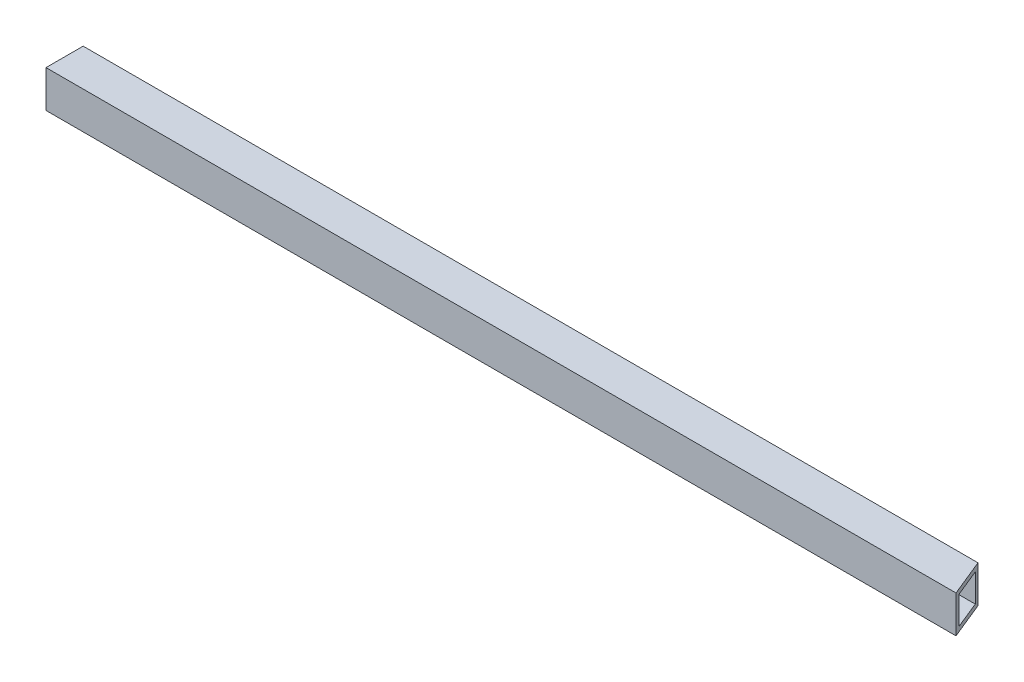
ISO-10303-21;
HEADER;
FILE_DESCRIPTION(('STEP AP214'),'2;1');
FILE_NAME('part.step','',(''),(''),'','','');
FILE_SCHEMA(('AUTOMOTIVE_DESIGN { 1 0 10303 214 1 1 1 1 }'));
ENDSEC;
DATA;
#1=APPLICATION_CONTEXT('core data for automotive mechanical design processes');
#2=APPLICATION_PROTOCOL_DEFINITION('international standard','automotive_design',2000,#1);
#3=PRODUCT_CONTEXT('',#1,'mechanical');
#4=PRODUCT('Part','Part','',(#3));
#5=PRODUCT_RELATED_PRODUCT_CATEGORY('part','',(#4));
#6=PRODUCT_DEFINITION_FORMATION('','',#4);
#7=PRODUCT_DEFINITION_CONTEXT('part definition',#1,'design');
#8=PRODUCT_DEFINITION('design','',#6,#7);
#9=PRODUCT_DEFINITION_SHAPE('','',#8);
#10=(LENGTH_UNIT() NAMED_UNIT(*) SI_UNIT(.MILLI.,.METRE.));
#11=(NAMED_UNIT(*) PLANE_ANGLE_UNIT() SI_UNIT($,.RADIAN.));
#12=(NAMED_UNIT(*) SI_UNIT($,.STERADIAN.) SOLID_ANGLE_UNIT());
#13=UNCERTAINTY_MEASURE_WITH_UNIT(LENGTH_MEASURE(1.E-05),#10,'distance_accuracy_value','');
#14=(GEOMETRIC_REPRESENTATION_CONTEXT(3) GLOBAL_UNCERTAINTY_ASSIGNED_CONTEXT((#13)) GLOBAL_UNIT_ASSIGNED_CONTEXT((#10,
#11,#12)) REPRESENTATION_CONTEXT('',''));
#15=CARTESIAN_POINT('',(0.,0.,0.));
#16=DIRECTION('',(0.,0.,1.));
#17=DIRECTION('',(1.,0.,0.));
#18=AXIS2_PLACEMENT_3D('',#15,#16,#17);
#19=CARTESIAN_POINT('',(0.,0.,0.));
#20=DIRECTION('',(1.,0.,0.));
#21=DIRECTION('',(0.,0.,-1.));
#22=AXIS2_PLACEMENT_3D('',#19,#20,#21);
#23=PLANE('',#22);
#24=DIRECTION('',(0.,1.,0.));
#25=VECTOR('',#24,1.);
#26=CARTESIAN_POINT('',(0.,12.7,-12.7));
#27=LINE('',#26,#25);
#28=CARTESIAN_POINT('',(0.,-12.7,-12.7));
#29=VERTEX_POINT('',#28);
#30=CARTESIAN_POINT('',(0.,12.7,-12.7));
#31=VERTEX_POINT('',#30);
#32=EDGE_CURVE('E117',#29,#31,#27,.T.);
#33=ORIENTED_EDGE('',*,*,#32,.F.);
#34=DIRECTION('',(0.,0.,-1.));
#35=VECTOR('',#34,1.);
#36=CARTESIAN_POINT('',(0.,-12.7,12.7));
#37=LINE('',#36,#35);
#38=CARTESIAN_POINT('',(0.,-12.7,12.7));
#39=VERTEX_POINT('',#38);
#40=EDGE_CURVE('E126',#39,#29,#37,.T.);
#41=ORIENTED_EDGE('',*,*,#40,.F.);
#42=DIRECTION('',(0.,-1.,0.));
#43=VECTOR('',#42,1.);
#44=CARTESIAN_POINT('',(0.,12.7,12.7));
#45=LINE('',#44,#43);
#46=CARTESIAN_POINT('',(0.,12.7,12.7));
#47=VERTEX_POINT('',#46);
#48=EDGE_CURVE('E129',#47,#39,#45,.T.);
#49=ORIENTED_EDGE('',*,*,#48,.F.);
#50=DIRECTION('',(0.,0.,1.));
#51=VECTOR('',#50,1.);
#52=CARTESIAN_POINT('',(0.,12.7,12.7));
#53=LINE('',#52,#51);
#54=EDGE_CURVE('E131',#31,#47,#53,.T.);
#55=ORIENTED_EDGE('',*,*,#54,.F.);
#56=EDGE_LOOP('',(#33,#41,#49,#55));
#57=FACE_BOUND('',#56,.T.);
#58=DIRECTION('',(0.,1.,0.));
#59=VECTOR('',#58,1.);
#60=CARTESIAN_POINT('',(0.,-9.525,-9.525));
#61=LINE('',#60,#59);
#62=CARTESIAN_POINT('',(0.,-9.525,-9.525));
#63=VERTEX_POINT('',#62);
#64=CARTESIAN_POINT('',(0.,9.525,-9.525));
#65=VERTEX_POINT('',#64);
#66=EDGE_CURVE('E151',#63,#65,#61,.T.);
#67=ORIENTED_EDGE('',*,*,#66,.T.);
#68=DIRECTION('',(0.,0.,1.));
#69=VECTOR('',#68,1.);
#70=CARTESIAN_POINT('',(0.,9.525,9.525));
#71=LINE('',#70,#69);
#72=CARTESIAN_POINT('',(0.,9.525,9.525));
#73=VERTEX_POINT('',#72);
#74=EDGE_CURVE('E148',#65,#73,#71,.T.);
#75=ORIENTED_EDGE('',*,*,#74,.T.);
#76=DIRECTION('',(0.,-1.,0.));
#77=VECTOR('',#76,1.);
#78=CARTESIAN_POINT('',(0.,-9.525,9.525));
#79=LINE('',#78,#77);
#80=CARTESIAN_POINT('',(0.,-9.525,9.525));
#81=VERTEX_POINT('',#80);
#82=EDGE_CURVE('E145',#73,#81,#79,.T.);
#83=ORIENTED_EDGE('',*,*,#82,.T.);
#84=DIRECTION('',(0.,0.,-1.));
#85=VECTOR('',#84,1.);
#86=CARTESIAN_POINT('',(0.,-9.525,9.525));
#87=LINE('',#86,#85);
#88=EDGE_CURVE('E142',#81,#63,#87,.T.);
#89=ORIENTED_EDGE('',*,*,#88,.T.);
#90=EDGE_LOOP('',(#67,#75,#83,#89));
#91=FACE_BOUND('',#90,.T.);
#92=ADVANCED_FACE('F33',(#57,#91),#23,.F.);
#93=CARTESIAN_POINT('',(622.3,12.7,-12.7));
#94=DIRECTION('',(0.,0.,1.));
#95=DIRECTION('',(0.,-1.,0.));
#96=AXIS2_PLACEMENT_3D('',#93,#94,#95);
#97=PLANE('',#96);
#98=DIRECTION('',(-1.,0.,0.));
#99=VECTOR('',#98,1.);
#100=CARTESIAN_POINT('',(622.3,12.7,-12.7));
#101=LINE('',#100,#99);
#102=CARTESIAN_POINT('',(611.938792348379,12.7,-12.7));
#103=VERTEX_POINT('',#102);
#104=EDGE_CURVE('E41',#103,#31,#101,.T.);
#105=ORIENTED_EDGE('',*,*,#104,.F.);
#106=DIRECTION('',(0.,1.,0.));
#107=VECTOR('',#106,1.);
#108=CARTESIAN_POINT('',(611.938792348379,-40.132,-12.7));
#109=LINE('',#108,#107);
#110=CARTESIAN_POINT('',(611.938792348379,-12.7,-12.7));
#111=VERTEX_POINT('',#110);
#112=EDGE_CURVE('E97',#111,#103,#109,.T.);
#113=ORIENTED_EDGE('',*,*,#112,.F.);
#114=DIRECTION('',(-1.,0.,0.));
#115=VECTOR('',#114,1.);
#116=CARTESIAN_POINT('',(622.3,-12.7,-12.7));
#117=LINE('',#116,#115);
#118=EDGE_CURVE('E123',#111,#29,#117,.T.);
#119=ORIENTED_EDGE('',*,*,#118,.T.);
#120=ORIENTED_EDGE('',*,*,#32,.T.);
#121=EDGE_LOOP('',(#105,#113,#119,#120));
#122=FACE_BOUND('',#121,.T.);
#123=ADVANCED_FACE('F35',(#122),#97,.F.);
#124=CARTESIAN_POINT('',(622.3,12.7,12.7));
#125=DIRECTION('',(0.,-1.,0.));
#126=DIRECTION('',(0.,0.,-1.));
#127=AXIS2_PLACEMENT_3D('',#124,#125,#126);
#128=PLANE('',#127);
#129=DIRECTION('',(-1.,0.,0.));
#130=VECTOR('',#129,1.);
#131=CARTESIAN_POINT('',(622.3,12.7,12.7));
#132=LINE('',#131,#130);
#133=CARTESIAN_POINT('',(622.3,12.7,12.7));
#134=VERTEX_POINT('',#133);
#135=EDGE_CURVE('E112',#134,#47,#132,.T.);
#136=ORIENTED_EDGE('',*,*,#135,.F.);
#137=DIRECTION('',(0.377705149155021,0.,0.925925925925926));
#138=VECTOR('',#137,1.);
#139=CARTESIAN_POINT('',(622.3,12.7,12.7));
#140=LINE('',#139,#138);
#141=EDGE_CURVE('E100',#103,#134,#140,.T.);
#142=ORIENTED_EDGE('',*,*,#141,.F.);
#143=ORIENTED_EDGE('',*,*,#104,.T.);
#144=ORIENTED_EDGE('',*,*,#54,.T.);
#145=EDGE_LOOP('',(#136,#142,#143,#144));
#146=FACE_BOUND('',#145,.T.);
#147=ADVANCED_FACE('F109',(#146),#128,.F.);
#148=CARTESIAN_POINT('',(622.3,12.7,12.7));
#149=DIRECTION('',(0.,0.,-1.));
#150=DIRECTION('',(0.,1.,0.));
#151=AXIS2_PLACEMENT_3D('',#148,#149,#150);
#152=PLANE('',#151);
#153=ORIENTED_EDGE('',*,*,#48,.T.);
#154=DIRECTION('',(-1.,0.,0.));
#155=VECTOR('',#154,1.);
#156=CARTESIAN_POINT('',(622.3,-12.7,12.7));
#157=LINE('',#156,#155);
#158=CARTESIAN_POINT('',(622.3,-12.7,12.7));
#159=VERTEX_POINT('',#158);
#160=EDGE_CURVE('E118',#159,#39,#157,.T.);
#161=ORIENTED_EDGE('',*,*,#160,.F.);
#162=DIRECTION('',(0.,-1.,0.));
#163=VECTOR('',#162,1.);
#164=CARTESIAN_POINT('',(622.3,12.7,12.7));
#165=LINE('',#164,#163);
#166=EDGE_CURVE('E125',#134,#159,#165,.T.);
#167=ORIENTED_EDGE('',*,*,#166,.F.);
#168=ORIENTED_EDGE('',*,*,#135,.T.);
#169=EDGE_LOOP('',(#153,#161,#167,#168));
#170=FACE_BOUND('',#169,.T.);
#171=ADVANCED_FACE('F181',(#170),#152,.F.);
#172=CARTESIAN_POINT('',(622.3,-12.7,12.7));
#173=DIRECTION('',(0.,1.,0.));
#174=DIRECTION('',(0.,0.,1.));
#175=AXIS2_PLACEMENT_3D('',#172,#173,#174);
#176=PLANE('',#175);
#177=ORIENTED_EDGE('',*,*,#118,.F.);
#178=DIRECTION('',(-0.377705149155021,0.,-0.925925925925926));
#179=VECTOR('',#178,1.);
#180=CARTESIAN_POINT('',(622.3,-12.7,12.7));
#181=LINE('',#180,#179);
#182=EDGE_CURVE('E103',#159,#111,#181,.T.);
#183=ORIENTED_EDGE('',*,*,#182,.F.);
#184=ORIENTED_EDGE('',*,*,#160,.T.);
#185=ORIENTED_EDGE('',*,*,#40,.T.);
#186=EDGE_LOOP('',(#177,#183,#184,#185));
#187=FACE_BOUND('',#186,.T.);
#188=ADVANCED_FACE('F174',(#187),#176,.F.);
#189=CARTESIAN_POINT('',(622.3,-9.525,-9.525));
#190=DIRECTION('',(0.,0.,1.));
#191=DIRECTION('',(1.,0.,0.));
#192=AXIS2_PLACEMENT_3D('',#189,#190,#191);
#193=PLANE('',#192);
#194=DIRECTION('',(0.,-1.,0.));
#195=VECTOR('',#194,1.);
#196=CARTESIAN_POINT('',(613.233943304832,-9.525,-9.525));
#197=LINE('',#196,#195);
#198=CARTESIAN_POINT('',(613.233943304832,9.525,-9.525));
#199=VERTEX_POINT('',#198);
#200=CARTESIAN_POINT('',(613.233943304832,-9.525,-9.525));
#201=VERTEX_POINT('',#200);
#202=EDGE_CURVE('E47',#199,#201,#197,.T.);
#203=ORIENTED_EDGE('',*,*,#202,.F.);
#204=DIRECTION('',(-1.,0.,0.));
#205=VECTOR('',#204,1.);
#206=CARTESIAN_POINT('',(622.3,9.525,-9.525));
#207=LINE('',#206,#205);
#208=EDGE_CURVE('E134',#199,#65,#207,.T.);
#209=ORIENTED_EDGE('',*,*,#208,.T.);
#210=ORIENTED_EDGE('',*,*,#66,.F.);
#211=DIRECTION('',(-1.,0.,0.));
#212=VECTOR('',#211,1.);
#213=CARTESIAN_POINT('',(622.3,-9.525,-9.525));
#214=LINE('',#213,#212);
#215=EDGE_CURVE('E54',#201,#63,#214,.T.);
#216=ORIENTED_EDGE('',*,*,#215,.F.);
#217=EDGE_LOOP('',(#203,#209,#210,#216));
#218=FACE_BOUND('',#217,.T.);
#219=ADVANCED_FACE('F172',(#218),#193,.T.);
#220=CARTESIAN_POINT('',(622.3,9.525,9.525));
#221=DIRECTION('',(0.,-1.,0.));
#222=DIRECTION('',(0.,0.,-1.));
#223=AXIS2_PLACEMENT_3D('',#220,#221,#222);
#224=PLANE('',#223);
#225=DIRECTION('',(-0.377705149155021,0.,-0.925925925925926));
#226=VECTOR('',#225,1.);
#227=CARTESIAN_POINT('',(621.189616806882,9.525,9.97794924554184));
#228=LINE('',#227,#226);
#229=CARTESIAN_POINT('',(621.004849043547,9.525,9.525));
#230=VERTEX_POINT('',#229);
#231=EDGE_CURVE('E155',#230,#199,#228,.T.);
#232=ORIENTED_EDGE('',*,*,#231,.F.);
#233=DIRECTION('',(-1.,0.,0.));
#234=VECTOR('',#233,1.);
#235=CARTESIAN_POINT('',(622.3,9.525,9.525));
#236=LINE('',#235,#234);
#237=EDGE_CURVE('E137',#230,#73,#236,.T.);
#238=ORIENTED_EDGE('',*,*,#237,.T.);
#239=ORIENTED_EDGE('',*,*,#74,.F.);
#240=ORIENTED_EDGE('',*,*,#208,.F.);
#241=EDGE_LOOP('',(#232,#238,#239,#240));
#242=FACE_BOUND('',#241,.T.);
#243=ADVANCED_FACE('F166',(#242),#224,.T.);
#244=CARTESIAN_POINT('',(622.3,-9.525,9.525));
#245=DIRECTION('',(0.,0.,-1.));
#246=DIRECTION('',(-1.,0.,0.));
#247=AXIS2_PLACEMENT_3D('',#244,#245,#246);
#248=PLANE('',#247);
#249=DIRECTION('',(0.,1.,0.));
#250=VECTOR('',#249,1.);
#251=CARTESIAN_POINT('',(621.004849043547,-9.525,9.525));
#252=LINE('',#251,#250);
#253=CARTESIAN_POINT('',(621.004849043547,-9.525,9.525));
#254=VERTEX_POINT('',#253);
#255=EDGE_CURVE('E157',#254,#230,#252,.T.);
#256=ORIENTED_EDGE('',*,*,#255,.F.);
#257=DIRECTION('',(-1.,0.,0.));
#258=VECTOR('',#257,1.);
#259=CARTESIAN_POINT('',(622.3,-9.525,9.525));
#260=LINE('',#259,#258);
#261=EDGE_CURVE('E139',#254,#81,#260,.T.);
#262=ORIENTED_EDGE('',*,*,#261,.T.);
#263=ORIENTED_EDGE('',*,*,#82,.F.);
#264=ORIENTED_EDGE('',*,*,#237,.F.);
#265=EDGE_LOOP('',(#256,#262,#263,#264));
#266=FACE_BOUND('',#265,.T.);
#267=ADVANCED_FACE('F169',(#266),#248,.T.);
#268=CARTESIAN_POINT('',(622.3,-9.525,9.525));
#269=DIRECTION('',(0.,1.,0.));
#270=DIRECTION('',(0.,0.,1.));
#271=AXIS2_PLACEMENT_3D('',#268,#269,#270);
#272=PLANE('',#271);
#273=DIRECTION('',(0.377705149155021,0.,0.925925925925926));
#274=VECTOR('',#273,1.);
#275=CARTESIAN_POINT('',(621.189616806882,-9.525,9.97794924554184));
#276=LINE('',#275,#274);
#277=EDGE_CURVE('E11',#201,#254,#276,.T.);
#278=ORIENTED_EDGE('',*,*,#277,.F.);
#279=ORIENTED_EDGE('',*,*,#215,.T.);
#280=ORIENTED_EDGE('',*,*,#88,.F.);
#281=ORIENTED_EDGE('',*,*,#261,.F.);
#282=EDGE_LOOP('',(#278,#279,#280,#281));
#283=FACE_BOUND('',#282,.T.);
#284=ADVANCED_FACE('F225',(#283),#272,.T.);
#285=CARTESIAN_POINT('',(622.3,-40.132,12.7));
#286=DIRECTION('',(-0.925925925925926,0.,0.37770514915502));
#287=DIRECTION('',(0.377705149155021,0.,0.925925925925926));
#288=AXIS2_PLACEMENT_3D('',#285,#286,#287);
#289=PLANE('',#288);
#290=ORIENTED_EDGE('',*,*,#202,.T.);
#291=ORIENTED_EDGE('',*,*,#277,.T.);
#292=ORIENTED_EDGE('',*,*,#255,.T.);
#293=ORIENTED_EDGE('',*,*,#231,.T.);
#294=EDGE_LOOP('',(#290,#291,#292,#293));
#295=FACE_BOUND('',#294,.T.);
#296=ORIENTED_EDGE('',*,*,#182,.T.);
#297=ORIENTED_EDGE('',*,*,#112,.T.);
#298=ORIENTED_EDGE('',*,*,#141,.T.);
#299=ORIENTED_EDGE('',*,*,#166,.T.);
#300=EDGE_LOOP('',(#296,#297,#298,#299));
#301=FACE_BOUND('',#300,.T.);
#302=ADVANCED_FACE('F99',(#295,#301),#289,.F.);
#303=CLOSED_SHELL('',(#92,#123,#147,#171,#188,#219,#243,#267,#284,#302));
#304=MANIFOLD_SOLID_BREP('B2',#303);
#305=ADVANCED_BREP_SHAPE_REPRESENTATION('',(#18,#304),#14);
#306=SHAPE_DEFINITION_REPRESENTATION(#9,#305);
ENDSEC;
END-ISO-10303-21;
